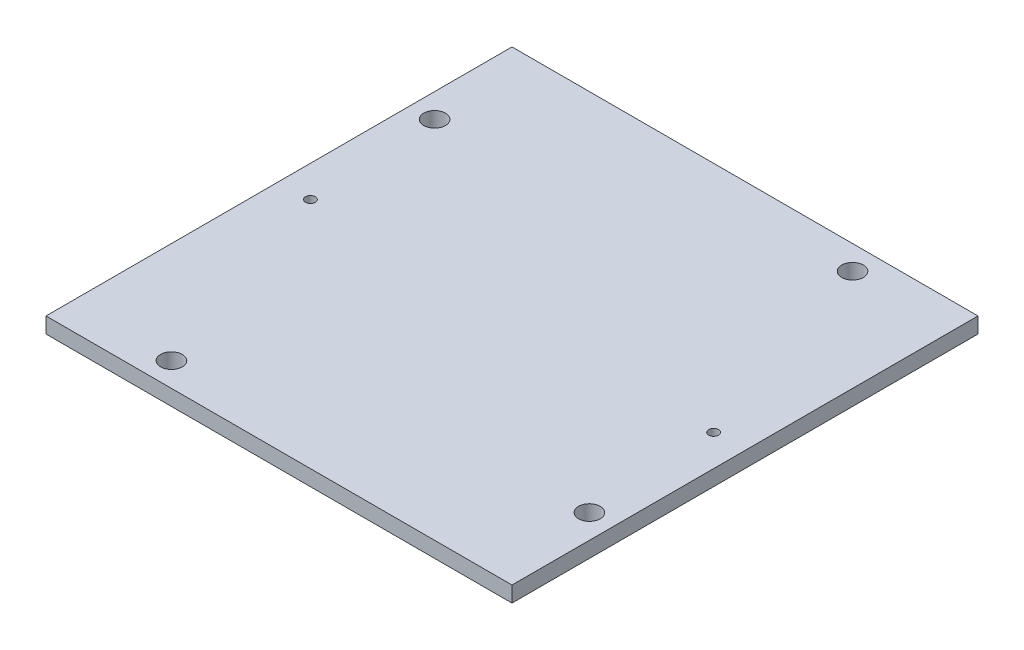
ISO-10303-21;
HEADER;
FILE_DESCRIPTION(('STEP AP214'),'2;1');
FILE_NAME('part.step','',(''),(''),'','','');
FILE_SCHEMA(('AUTOMOTIVE_DESIGN { 1 0 10303 214 1 1 1 1 }'));
ENDSEC;
DATA;
#1=APPLICATION_CONTEXT('core data for automotive mechanical design processes');
#2=APPLICATION_PROTOCOL_DEFINITION('international standard','automotive_design',2000,#1);
#3=PRODUCT_CONTEXT('',#1,'mechanical');
#4=PRODUCT('Part','Part','',(#3));
#5=PRODUCT_RELATED_PRODUCT_CATEGORY('part','',(#4));
#6=PRODUCT_DEFINITION_FORMATION('','',#4);
#7=PRODUCT_DEFINITION_CONTEXT('part definition',#1,'design');
#8=PRODUCT_DEFINITION('design','',#6,#7);
#9=PRODUCT_DEFINITION_SHAPE('','',#8);
#10=(LENGTH_UNIT() NAMED_UNIT(*) SI_UNIT(.MILLI.,.METRE.));
#11=(NAMED_UNIT(*) PLANE_ANGLE_UNIT() SI_UNIT($,.RADIAN.));
#12=(NAMED_UNIT(*) SI_UNIT($,.STERADIAN.) SOLID_ANGLE_UNIT());
#13=UNCERTAINTY_MEASURE_WITH_UNIT(LENGTH_MEASURE(1.E-05),#10,'distance_accuracy_value','');
#14=(GEOMETRIC_REPRESENTATION_CONTEXT(3) GLOBAL_UNCERTAINTY_ASSIGNED_CONTEXT((#13)) GLOBAL_UNIT_ASSIGNED_CONTEXT((#10,
#11,#12)) REPRESENTATION_CONTEXT('',''));
#15=CARTESIAN_POINT('',(0.,0.,0.));
#16=DIRECTION('',(0.,0.,1.));
#17=DIRECTION('',(1.,0.,0.));
#18=AXIS2_PLACEMENT_3D('',#15,#16,#17);
#19=CARTESIAN_POINT('',(23.7744,1.6002,-23.7744));
#20=DIRECTION('',(-1.,0.,0.));
#21=DIRECTION('',(0.,0.,1.));
#22=AXIS2_PLACEMENT_3D('',#19,#20,#21);
#23=PLANE('',#22);
#24=DIRECTION('',(0.,0.,-1.));
#25=VECTOR('',#24,1.);
#26=CARTESIAN_POINT('',(23.7744,0.,-23.7744));
#27=LINE('',#26,#25);
#28=CARTESIAN_POINT('',(23.7744,0.,23.7744));
#29=VERTEX_POINT('',#28);
#30=CARTESIAN_POINT('',(23.7744,0.,-23.7744));
#31=VERTEX_POINT('',#30);
#32=EDGE_CURVE('E96',#29,#31,#27,.T.);
#33=ORIENTED_EDGE('',*,*,#32,.T.);
#34=DIRECTION('',(0.,-1.,0.));
#35=VECTOR('',#34,1.);
#36=CARTESIAN_POINT('',(23.7744,1.6002,-23.7744));
#37=LINE('',#36,#35);
#38=CARTESIAN_POINT('',(23.7744,1.6002,-23.7744));
#39=VERTEX_POINT('',#38);
#40=EDGE_CURVE('E11',#39,#31,#37,.T.);
#41=ORIENTED_EDGE('',*,*,#40,.F.);
#42=DIRECTION('',(0.,0.,-1.));
#43=VECTOR('',#42,1.);
#44=CARTESIAN_POINT('',(23.7744,1.6002,-23.7744));
#45=LINE('',#44,#43);
#46=CARTESIAN_POINT('',(23.7744,1.6002,23.7744));
#47=VERTEX_POINT('',#46);
#48=EDGE_CURVE('E84',#47,#39,#45,.T.);
#49=ORIENTED_EDGE('',*,*,#48,.F.);
#50=DIRECTION('',(0.,-1.,0.));
#51=VECTOR('',#50,1.);
#52=CARTESIAN_POINT('',(23.7744,1.6002,23.7744));
#53=LINE('',#52,#51);
#54=EDGE_CURVE('E92',#47,#29,#53,.T.);
#55=ORIENTED_EDGE('',*,*,#54,.T.);
#56=EDGE_LOOP('',(#33,#41,#49,#55));
#57=FACE_BOUND('',#56,.T.);
#58=ADVANCED_FACE('F33',(#57),#23,.F.);
#59=CARTESIAN_POINT('',(-23.7744,1.6002,-23.7744));
#60=DIRECTION('',(0.,0.,1.));
#61=DIRECTION('',(1.,0.,0.));
#62=AXIS2_PLACEMENT_3D('',#59,#60,#61);
#63=PLANE('',#62);
#64=DIRECTION('',(-1.,0.,0.));
#65=VECTOR('',#64,1.);
#66=CARTESIAN_POINT('',(-23.7744,0.,-23.7744));
#67=LINE('',#66,#65);
#68=CARTESIAN_POINT('',(-23.7744,0.,-23.7744));
#69=VERTEX_POINT('',#68);
#70=EDGE_CURVE('E88',#31,#69,#67,.T.);
#71=ORIENTED_EDGE('',*,*,#70,.T.);
#72=DIRECTION('',(0.,-1.,0.));
#73=VECTOR('',#72,1.);
#74=CARTESIAN_POINT('',(-23.7744,1.6002,-23.7744));
#75=LINE('',#74,#73);
#76=CARTESIAN_POINT('',(-23.7744,1.6002,-23.7744));
#77=VERTEX_POINT('',#76);
#78=EDGE_CURVE('E41',#77,#69,#75,.T.);
#79=ORIENTED_EDGE('',*,*,#78,.F.);
#80=DIRECTION('',(-1.,0.,0.));
#81=VECTOR('',#80,1.);
#82=CARTESIAN_POINT('',(-23.7744,1.6002,-23.7744));
#83=LINE('',#82,#81);
#84=EDGE_CURVE('E79',#39,#77,#83,.T.);
#85=ORIENTED_EDGE('',*,*,#84,.F.);
#86=ORIENTED_EDGE('',*,*,#40,.T.);
#87=EDGE_LOOP('',(#71,#79,#85,#86));
#88=FACE_BOUND('',#87,.T.);
#89=ADVANCED_FACE('F87',(#88),#63,.F.);
#90=CARTESIAN_POINT('',(-23.7744,1.6002,-23.7744));
#91=DIRECTION('',(1.,0.,0.));
#92=DIRECTION('',(0.,0.,-1.));
#93=AXIS2_PLACEMENT_3D('',#90,#91,#92);
#94=PLANE('',#93);
#95=DIRECTION('',(0.,0.,1.));
#96=VECTOR('',#95,1.);
#97=CARTESIAN_POINT('',(-23.7744,0.,-23.7744));
#98=LINE('',#97,#96);
#99=CARTESIAN_POINT('',(-23.7744,0.,23.7744));
#100=VERTEX_POINT('',#99);
#101=EDGE_CURVE('E66',#69,#100,#98,.T.);
#102=ORIENTED_EDGE('',*,*,#101,.T.);
#103=DIRECTION('',(0.,-1.,0.));
#104=VECTOR('',#103,1.);
#105=CARTESIAN_POINT('',(-23.7744,1.6002,23.7744));
#106=LINE('',#105,#104);
#107=CARTESIAN_POINT('',(-23.7744,1.6002,23.7744));
#108=VERTEX_POINT('',#107);
#109=EDGE_CURVE('E89',#108,#100,#106,.T.);
#110=ORIENTED_EDGE('',*,*,#109,.F.);
#111=DIRECTION('',(0.,0.,1.));
#112=VECTOR('',#111,1.);
#113=CARTESIAN_POINT('',(-23.7744,1.6002,-23.7744));
#114=LINE('',#113,#112);
#115=EDGE_CURVE('E82',#77,#108,#114,.T.);
#116=ORIENTED_EDGE('',*,*,#115,.F.);
#117=ORIENTED_EDGE('',*,*,#78,.T.);
#118=EDGE_LOOP('',(#102,#110,#116,#117));
#119=FACE_BOUND('',#118,.T.);
#120=ADVANCED_FACE('F90',(#119),#94,.F.);
#121=CARTESIAN_POINT('',(-23.7744,1.6002,23.7744));
#122=DIRECTION('',(0.,0.,-1.));
#123=DIRECTION('',(-1.,0.,0.));
#124=AXIS2_PLACEMENT_3D('',#121,#122,#123);
#125=PLANE('',#124);
#126=DIRECTION('',(1.,0.,0.));
#127=VECTOR('',#126,1.);
#128=CARTESIAN_POINT('',(-23.7744,0.,23.7744));
#129=LINE('',#128,#127);
#130=EDGE_CURVE('E72',#100,#29,#129,.T.);
#131=ORIENTED_EDGE('',*,*,#130,.T.);
#132=ORIENTED_EDGE('',*,*,#54,.F.);
#133=DIRECTION('',(1.,0.,0.));
#134=VECTOR('',#133,1.);
#135=CARTESIAN_POINT('',(-23.7744,1.6002,23.7744));
#136=LINE('',#135,#134);
#137=EDGE_CURVE('E49',#108,#47,#136,.T.);
#138=ORIENTED_EDGE('',*,*,#137,.F.);
#139=ORIENTED_EDGE('',*,*,#109,.T.);
#140=EDGE_LOOP('',(#131,#132,#138,#139));
#141=FACE_BOUND('',#140,.T.);
#142=ADVANCED_FACE('F104',(#141),#125,.F.);
#143=CARTESIAN_POINT('',(0.,1.6002,0.));
#144=DIRECTION('',(0.,1.,0.));
#145=DIRECTION('',(0.,0.,1.));
#146=AXIS2_PLACEMENT_3D('',#143,#144,#145);
#147=PLANE('',#146);
#148=CARTESIAN_POINT('',(-21.3233,1.6002,-13.4239));
#149=DIRECTION('',(0.,1.,0.));
#150=DIRECTION('',(0.,0.,1.));
#151=AXIS2_PLACEMENT_3D('',#148,#149,#150);
#152=CIRCLE('',#151,1.1049);
#153=CARTESIAN_POINT('',(-21.3233,1.6002,-12.319));
#154=VERTEX_POINT('',#153);
#155=EDGE_CURVE('E119',#154,#154,#152,.T.);
#156=ORIENTED_EDGE('',*,*,#155,.F.);
#157=EDGE_LOOP('',(#156));
#158=FACE_BOUND('',#157,.T.);
#159=CARTESIAN_POINT('',(20.574,1.6002,0.));
#160=DIRECTION('',(0.,1.,0.));
#161=DIRECTION('',(0.,0.,1.));
#162=AXIS2_PLACEMENT_3D('',#159,#160,#161);
#163=CIRCLE('',#162,0.499999999999999);
#164=CARTESIAN_POINT('',(20.574,1.6002,0.499999999999999));
#165=VERTEX_POINT('',#164);
#166=EDGE_CURVE('E113',#165,#165,#163,.T.);
#167=ORIENTED_EDGE('',*,*,#166,.F.);
#168=EDGE_LOOP('',(#167));
#169=FACE_BOUND('',#168,.T.);
#170=CARTESIAN_POINT('',(-13.4239,1.6002,21.3233));
#171=DIRECTION('',(0.,1.,0.));
#172=DIRECTION('',(0.,0.,1.));
#173=AXIS2_PLACEMENT_3D('',#170,#171,#172);
#174=CIRCLE('',#173,1.1049);
#175=CARTESIAN_POINT('',(-13.4239,1.6002,22.4282));
#176=VERTEX_POINT('',#175);
#177=EDGE_CURVE('E126',#176,#176,#174,.T.);
#178=ORIENTED_EDGE('',*,*,#177,.F.);
#179=EDGE_LOOP('',(#178));
#180=FACE_BOUND('',#179,.T.);
#181=CARTESIAN_POINT('',(21.3233,1.6002,13.4239));
#182=DIRECTION('',(0.,1.,0.));
#183=DIRECTION('',(0.,0.,1.));
#184=AXIS2_PLACEMENT_3D('',#181,#182,#183);
#185=CIRCLE('',#184,1.1049);
#186=CARTESIAN_POINT('',(21.3233,1.6002,14.5288));
#187=VERTEX_POINT('',#186);
#188=EDGE_CURVE('E127',#187,#187,#185,.T.);
#189=ORIENTED_EDGE('',*,*,#188,.F.);
#190=EDGE_LOOP('',(#189));
#191=FACE_BOUND('',#190,.T.);
#192=CARTESIAN_POINT('',(13.4239,1.6002,-21.3233));
#193=DIRECTION('',(0.,1.,0.));
#194=DIRECTION('',(0.,0.,1.));
#195=AXIS2_PLACEMENT_3D('',#192,#193,#194);
#196=CIRCLE('',#195,1.1049);
#197=CARTESIAN_POINT('',(13.4239,1.6002,-20.2184));
#198=VERTEX_POINT('',#197);
#199=EDGE_CURVE('E137',#198,#198,#196,.T.);
#200=ORIENTED_EDGE('',*,*,#199,.F.);
#201=EDGE_LOOP('',(#200));
#202=FACE_BOUND('',#201,.T.);
#203=CARTESIAN_POINT('',(-20.574,1.6002,0.));
#204=DIRECTION('',(0.,1.,0.));
#205=DIRECTION('',(0.,0.,1.));
#206=AXIS2_PLACEMENT_3D('',#203,#204,#205);
#207=CIRCLE('',#206,0.499999999999999);
#208=CARTESIAN_POINT('',(-20.574,1.6002,0.500000000000002));
#209=VERTEX_POINT('',#208);
#210=EDGE_CURVE('E110',#209,#209,#207,.T.);
#211=ORIENTED_EDGE('',*,*,#210,.F.);
#212=EDGE_LOOP('',(#211));
#213=FACE_BOUND('',#212,.T.);
#214=ORIENTED_EDGE('',*,*,#48,.T.);
#215=ORIENTED_EDGE('',*,*,#84,.T.);
#216=ORIENTED_EDGE('',*,*,#115,.T.);
#217=ORIENTED_EDGE('',*,*,#137,.T.);
#218=EDGE_LOOP('',(#214,#215,#216,#217));
#219=FACE_BOUND('',#218,.T.);
#220=ADVANCED_FACE('F80',(#158,#169,#180,#191,#202,#213,#219),#147,.T.);
#221=CARTESIAN_POINT('',(0.,0.,0.));
#222=DIRECTION('',(0.,1.,0.));
#223=DIRECTION('',(0.,0.,1.));
#224=AXIS2_PLACEMENT_3D('',#221,#222,#223);
#225=PLANE('',#224);
#226=CARTESIAN_POINT('',(-21.3233,0.,-13.4239));
#227=DIRECTION('',(0.,1.,0.));
#228=DIRECTION('',(0.,0.,1.));
#229=AXIS2_PLACEMENT_3D('',#226,#227,#228);
#230=CIRCLE('',#229,1.1049);
#231=CARTESIAN_POINT('',(-21.3233,0.,-12.319));
#232=VERTEX_POINT('',#231);
#233=EDGE_CURVE('E116',#232,#232,#230,.T.);
#234=ORIENTED_EDGE('',*,*,#233,.T.);
#235=EDGE_LOOP('',(#234));
#236=FACE_BOUND('',#235,.T.);
#237=CARTESIAN_POINT('',(20.574,0.,0.));
#238=DIRECTION('',(0.,1.,0.));
#239=DIRECTION('',(0.,0.,1.));
#240=AXIS2_PLACEMENT_3D('',#237,#238,#239);
#241=CIRCLE('',#240,0.499999999999999);
#242=CARTESIAN_POINT('',(20.574,0.,0.499999999999999));
#243=VERTEX_POINT('',#242);
#244=EDGE_CURVE('E130',#243,#243,#241,.T.);
#245=ORIENTED_EDGE('',*,*,#244,.T.);
#246=EDGE_LOOP('',(#245));
#247=FACE_BOUND('',#246,.T.);
#248=CARTESIAN_POINT('',(-13.4239,0.,21.3233));
#249=DIRECTION('',(0.,1.,0.));
#250=DIRECTION('',(0.,0.,1.));
#251=AXIS2_PLACEMENT_3D('',#248,#249,#250);
#252=CIRCLE('',#251,1.1049);
#253=CARTESIAN_POINT('',(-13.4239,0.,22.4282));
#254=VERTEX_POINT('',#253);
#255=EDGE_CURVE('E123',#254,#254,#252,.T.);
#256=ORIENTED_EDGE('',*,*,#255,.T.);
#257=EDGE_LOOP('',(#256));
#258=FACE_BOUND('',#257,.T.);
#259=CARTESIAN_POINT('',(21.3233,0.,13.4239));
#260=DIRECTION('',(0.,1.,0.));
#261=DIRECTION('',(0.,0.,1.));
#262=AXIS2_PLACEMENT_3D('',#259,#260,#261);
#263=CIRCLE('',#262,1.1049);
#264=CARTESIAN_POINT('',(21.3233,0.,14.5288));
#265=VERTEX_POINT('',#264);
#266=EDGE_CURVE('E140',#265,#265,#263,.T.);
#267=ORIENTED_EDGE('',*,*,#266,.T.);
#268=EDGE_LOOP('',(#267));
#269=FACE_BOUND('',#268,.T.);
#270=CARTESIAN_POINT('',(13.4239,0.,-21.3233));
#271=DIRECTION('',(0.,1.,0.));
#272=DIRECTION('',(0.,0.,1.));
#273=AXIS2_PLACEMENT_3D('',#270,#271,#272);
#274=CIRCLE('',#273,1.1049);
#275=CARTESIAN_POINT('',(13.4239,0.,-20.2184));
#276=VERTEX_POINT('',#275);
#277=EDGE_CURVE('E122',#276,#276,#274,.T.);
#278=ORIENTED_EDGE('',*,*,#277,.T.);
#279=EDGE_LOOP('',(#278));
#280=FACE_BOUND('',#279,.T.);
#281=CARTESIAN_POINT('',(-20.574,0.,0.));
#282=DIRECTION('',(0.,1.,0.));
#283=DIRECTION('',(0.,0.,1.));
#284=AXIS2_PLACEMENT_3D('',#281,#282,#283);
#285=CIRCLE('',#284,0.499999999999999);
#286=CARTESIAN_POINT('',(-20.574,0.,0.500000000000002));
#287=VERTEX_POINT('',#286);
#288=EDGE_CURVE('E99',#287,#287,#285,.T.);
#289=ORIENTED_EDGE('',*,*,#288,.T.);
#290=EDGE_LOOP('',(#289));
#291=FACE_BOUND('',#290,.T.);
#292=ORIENTED_EDGE('',*,*,#32,.F.);
#293=ORIENTED_EDGE('',*,*,#130,.F.);
#294=ORIENTED_EDGE('',*,*,#101,.F.);
#295=ORIENTED_EDGE('',*,*,#70,.F.);
#296=EDGE_LOOP('',(#292,#293,#294,#295));
#297=FACE_BOUND('',#296,.T.);
#298=ADVANCED_FACE('F107',(#236,#247,#258,#269,#280,#291,#297),#225,.F.);
#299=CARTESIAN_POINT('',(-20.574,0.,0.));
#300=DIRECTION('',(0.,1.,0.));
#301=DIRECTION('',(0.,0.,1.));
#302=AXIS2_PLACEMENT_3D('',#299,#300,#301);
#303=CYLINDRICAL_SURFACE('',#302,0.499999999999999);
#304=ORIENTED_EDGE('',*,*,#288,.F.);
#305=EDGE_LOOP('',(#304));
#306=FACE_BOUND('',#305,.T.);
#307=ORIENTED_EDGE('',*,*,#210,.T.);
#308=EDGE_LOOP('',(#307));
#309=FACE_BOUND('',#308,.T.);
#310=ADVANCED_FACE('F156',(#306,#309),#303,.F.);
#311=CARTESIAN_POINT('',(13.4239,0.,-21.3233));
#312=DIRECTION('',(0.,1.,0.));
#313=DIRECTION('',(0.,0.,1.));
#314=AXIS2_PLACEMENT_3D('',#311,#312,#313);
#315=CYLINDRICAL_SURFACE('',#314,1.1049);
#316=ORIENTED_EDGE('',*,*,#277,.F.);
#317=EDGE_LOOP('',(#316));
#318=FACE_BOUND('',#317,.T.);
#319=ORIENTED_EDGE('',*,*,#199,.T.);
#320=EDGE_LOOP('',(#319));
#321=FACE_BOUND('',#320,.T.);
#322=ADVANCED_FACE('F158',(#318,#321),#315,.F.);
#323=CARTESIAN_POINT('',(21.3233,0.,13.4239));
#324=DIRECTION('',(0.,1.,0.));
#325=DIRECTION('',(0.,0.,1.));
#326=AXIS2_PLACEMENT_3D('',#323,#324,#325);
#327=CYLINDRICAL_SURFACE('',#326,1.1049);
#328=ORIENTED_EDGE('',*,*,#266,.F.);
#329=EDGE_LOOP('',(#328));
#330=FACE_BOUND('',#329,.T.);
#331=ORIENTED_EDGE('',*,*,#188,.T.);
#332=EDGE_LOOP('',(#331));
#333=FACE_BOUND('',#332,.T.);
#334=ADVANCED_FACE('F146',(#330,#333),#327,.F.);
#335=CARTESIAN_POINT('',(-13.4239,0.,21.3233));
#336=DIRECTION('',(0.,1.,0.));
#337=DIRECTION('',(0.,0.,1.));
#338=AXIS2_PLACEMENT_3D('',#335,#336,#337);
#339=CYLINDRICAL_SURFACE('',#338,1.1049);
#340=ORIENTED_EDGE('',*,*,#255,.F.);
#341=EDGE_LOOP('',(#340));
#342=FACE_BOUND('',#341,.T.);
#343=ORIENTED_EDGE('',*,*,#177,.T.);
#344=EDGE_LOOP('',(#343));
#345=FACE_BOUND('',#344,.T.);
#346=ADVANCED_FACE('F212',(#342,#345),#339,.F.);
#347=CARTESIAN_POINT('',(20.574,0.,0.));
#348=DIRECTION('',(0.,1.,0.));
#349=DIRECTION('',(0.,0.,1.));
#350=AXIS2_PLACEMENT_3D('',#347,#348,#349);
#351=CYLINDRICAL_SURFACE('',#350,0.499999999999999);
#352=ORIENTED_EDGE('',*,*,#244,.F.);
#353=EDGE_LOOP('',(#352));
#354=FACE_BOUND('',#353,.T.);
#355=ORIENTED_EDGE('',*,*,#166,.T.);
#356=EDGE_LOOP('',(#355));
#357=FACE_BOUND('',#356,.T.);
#358=ADVANCED_FACE('F222',(#354,#357),#351,.F.);
#359=CARTESIAN_POINT('',(-21.3233,0.,-13.4239));
#360=DIRECTION('',(0.,1.,0.));
#361=DIRECTION('',(0.,0.,1.));
#362=AXIS2_PLACEMENT_3D('',#359,#360,#361);
#363=CYLINDRICAL_SURFACE('',#362,1.1049);
#364=ORIENTED_EDGE('',*,*,#233,.F.);
#365=EDGE_LOOP('',(#364));
#366=FACE_BOUND('',#365,.T.);
#367=ORIENTED_EDGE('',*,*,#155,.T.);
#368=EDGE_LOOP('',(#367));
#369=FACE_BOUND('',#368,.T.);
#370=ADVANCED_FACE('F232',(#366,#369),#363,.F.);
#371=CLOSED_SHELL('',(#58,#89,#120,#142,#220,#298,#310,#322,#334,#346,#358,#370));
#372=MANIFOLD_SOLID_BREP('B2',#371);
#373=ADVANCED_BREP_SHAPE_REPRESENTATION('',(#18,#372),#14);
#374=SHAPE_DEFINITION_REPRESENTATION(#9,#373);
ENDSEC;
END-ISO-10303-21;
